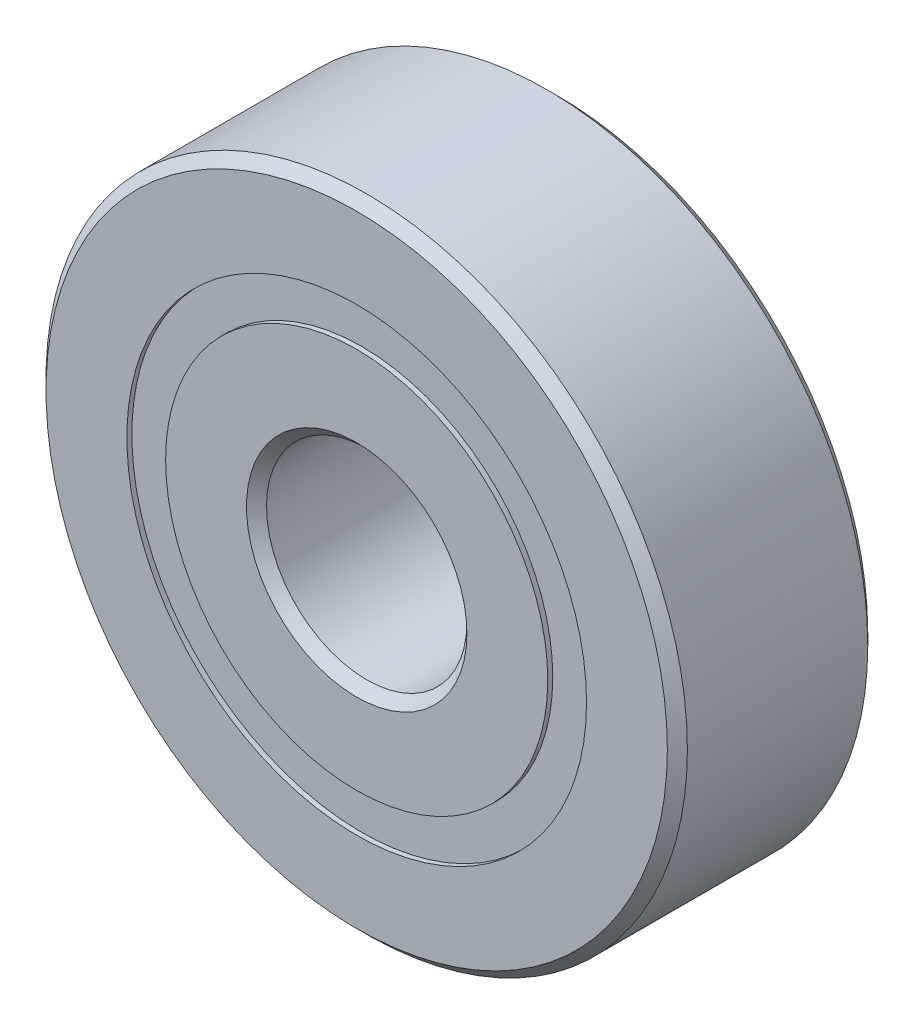
ISO-10303-21;
HEADER;
FILE_DESCRIPTION(('STEP AP214'),'2;1');
FILE_NAME('part.step','',(''),(''),'','','');
FILE_SCHEMA(('AUTOMOTIVE_DESIGN { 1 0 10303 214 1 1 1 1 }'));
ENDSEC;
DATA;
#1=APPLICATION_CONTEXT('core data for automotive mechanical design processes');
#2=APPLICATION_PROTOCOL_DEFINITION('international standard','automotive_design',2000,#1);
#3=PRODUCT_CONTEXT('',#1,'mechanical');
#4=PRODUCT('Part','Part','',(#3));
#5=PRODUCT_RELATED_PRODUCT_CATEGORY('part','',(#4));
#6=PRODUCT_DEFINITION_FORMATION('','',#4);
#7=PRODUCT_DEFINITION_CONTEXT('part definition',#1,'design');
#8=PRODUCT_DEFINITION('design','',#6,#7);
#9=PRODUCT_DEFINITION_SHAPE('','',#8);
#10=(LENGTH_UNIT() NAMED_UNIT(*) SI_UNIT(.MILLI.,.METRE.));
#11=(NAMED_UNIT(*) PLANE_ANGLE_UNIT() SI_UNIT($,.RADIAN.));
#12=(NAMED_UNIT(*) SI_UNIT($,.STERADIAN.) SOLID_ANGLE_UNIT());
#13=UNCERTAINTY_MEASURE_WITH_UNIT(LENGTH_MEASURE(1.E-05),#10,'distance_accuracy_value','');
#14=(GEOMETRIC_REPRESENTATION_CONTEXT(3) GLOBAL_UNCERTAINTY_ASSIGNED_CONTEXT((#13)) GLOBAL_UNIT_ASSIGNED_CONTEXT((#10,
#11,#12)) REPRESENTATION_CONTEXT('',''));
#15=CARTESIAN_POINT('',(0.,0.,0.));
#16=DIRECTION('',(0.,0.,1.));
#17=DIRECTION('',(1.,0.,0.));
#18=AXIS2_PLACEMENT_3D('',#15,#16,#17);
#19=CARTESIAN_POINT('',(0.,5.73351648351649,-2.375));
#20=DIRECTION('',(0.,0.,1.));
#21=DIRECTION('',(1.,0.,0.));
#22=AXIS2_PLACEMENT_3D('',#19,#20,#21);
#23=PLANE('',#22);
#24=CARTESIAN_POINT('',(0.,0.,-2.375));
#25=DIRECTION('',(0.,0.,1.));
#26=DIRECTION('',(1.,0.,0.));
#27=AXIS2_PLACEMENT_3D('',#24,#25,#26);
#28=CIRCLE('',#27,5.73351648351649);
#29=CARTESIAN_POINT('',(5.73351648351649,0.,-2.375));
#30=VERTEX_POINT('',#29);
#31=EDGE_CURVE('E55',#30,#30,#28,.T.);
#32=ORIENTED_EDGE('',*,*,#31,.F.);
#33=EDGE_LOOP('',(#32));
#34=FACE_BOUND('',#33,.T.);
#35=CARTESIAN_POINT('',(0.,0.,-2.375));
#36=DIRECTION('',(0.,0.,1.));
#37=DIRECTION('',(1.,0.,0.));
#38=AXIS2_PLACEMENT_3D('',#35,#36,#37);
#39=CIRCLE('',#38,4.76648351648352);
#40=CARTESIAN_POINT('',(4.76648351648352,0.,-2.375));
#41=VERTEX_POINT('',#40);
#42=EDGE_CURVE('E11',#41,#41,#39,.T.);
#43=ORIENTED_EDGE('',*,*,#42,.T.);
#44=EDGE_LOOP('',(#43));
#45=FACE_BOUND('',#44,.T.);
#46=ADVANCED_FACE('F41',(#34,#45),#23,.F.);
#47=CARTESIAN_POINT('',(0.,0.,2.5));
#48=DIRECTION('',(0.,0.,1.));
#49=DIRECTION('',(1.,0.,0.));
#50=AXIS2_PLACEMENT_3D('',#47,#48,#49);
#51=CYLINDRICAL_SURFACE('',#50,4.76648351648352);
#52=ORIENTED_EDGE('',*,*,#42,.F.);
#53=EDGE_LOOP('',(#52));
#54=FACE_BOUND('',#53,.T.);
#55=CARTESIAN_POINT('',(0.,0.,-1.21175743903915));
#56=DIRECTION('',(0.,0.,1.));
#57=DIRECTION('',(1.,0.,0.));
#58=AXIS2_PLACEMENT_3D('',#55,#56,#57);
#59=CIRCLE('',#58,4.76648351648352);
#60=CARTESIAN_POINT('',(4.76648351648352,0.,-1.21175743903915));
#61=VERTEX_POINT('',#60);
#62=EDGE_CURVE('E47',#61,#61,#59,.T.);
#63=ORIENTED_EDGE('',*,*,#62,.T.);
#64=EDGE_LOOP('',(#63));
#65=FACE_BOUND('',#64,.T.);
#66=ADVANCED_FACE('F64',(#54,#65),#51,.F.);
#67=CARTESIAN_POINT('',(0.,5.73351648351649,-1.21175743903915));
#68=DIRECTION('',(0.,0.,-1.));
#69=DIRECTION('',(-1.,0.,0.));
#70=AXIS2_PLACEMENT_3D('',#67,#68,#69);
#71=PLANE('',#70);
#72=ORIENTED_EDGE('',*,*,#62,.F.);
#73=EDGE_LOOP('',(#72));
#74=FACE_BOUND('',#73,.T.);
#75=CARTESIAN_POINT('',(0.,0.,-1.21175743903915));
#76=DIRECTION('',(0.,0.,1.));
#77=DIRECTION('',(1.,0.,0.));
#78=AXIS2_PLACEMENT_3D('',#75,#76,#77);
#79=CIRCLE('',#78,5.73351648351649);
#80=CARTESIAN_POINT('',(5.73351648351649,0.,-1.21175743903915));
#81=VERTEX_POINT('',#80);
#82=EDGE_CURVE('E51',#81,#81,#79,.T.);
#83=ORIENTED_EDGE('',*,*,#82,.T.);
#84=EDGE_LOOP('',(#83));
#85=FACE_BOUND('',#84,.T.);
#86=ADVANCED_FACE('F68',(#74,#85),#71,.F.);
#87=CARTESIAN_POINT('',(0.,0.,2.5));
#88=DIRECTION('',(0.,0.,1.));
#89=DIRECTION('',(1.,0.,0.));
#90=AXIS2_PLACEMENT_3D('',#87,#88,#89);
#91=CYLINDRICAL_SURFACE('',#90,5.73351648351649);
#92=ORIENTED_EDGE('',*,*,#82,.F.);
#93=EDGE_LOOP('',(#92));
#94=FACE_BOUND('',#93,.T.);
#95=ORIENTED_EDGE('',*,*,#31,.T.);
#96=EDGE_LOOP('',(#95));
#97=FACE_BOUND('',#96,.T.);
#98=ADVANCED_FACE('F61',(#94,#97),#91,.T.);
#99=CLOSED_SHELL('',(#46,#66,#86,#98));
#100=MANIFOLD_SOLID_BREP('B2',#99);
#101=CARTESIAN_POINT('',(0.,5.73351648351648,2.375));
#102=DIRECTION('',(0.,0.,-1.));
#103=DIRECTION('',(-1.,0.,0.));
#104=AXIS2_PLACEMENT_3D('',#101,#102,#103);
#105=PLANE('',#104);
#106=CARTESIAN_POINT('',(0.,0.,2.375));
#107=DIRECTION('',(0.,0.,1.));
#108=DIRECTION('',(1.,0.,0.));
#109=AXIS2_PLACEMENT_3D('',#106,#107,#108);
#110=CIRCLE('',#109,4.76648351648352);
#111=CARTESIAN_POINT('',(4.76648351648352,0.,2.375));
#112=VERTEX_POINT('',#111);
#113=EDGE_CURVE('E40',#112,#112,#110,.T.);
#114=ORIENTED_EDGE('',*,*,#113,.F.);
#115=EDGE_LOOP('',(#114));
#116=FACE_BOUND('',#115,.T.);
#117=CARTESIAN_POINT('',(0.,0.,2.375));
#118=DIRECTION('',(0.,0.,1.));
#119=DIRECTION('',(1.,0.,0.));
#120=AXIS2_PLACEMENT_3D('',#117,#118,#119);
#121=CIRCLE('',#120,5.73351648351648);
#122=CARTESIAN_POINT('',(5.73351648351648,0.,2.375));
#123=VERTEX_POINT('',#122);
#124=EDGE_CURVE('E122',#123,#123,#121,.T.);
#125=ORIENTED_EDGE('',*,*,#124,.T.);
#126=EDGE_LOOP('',(#125));
#127=FACE_BOUND('',#126,.T.);
#128=ADVANCED_FACE('F108',(#116,#127),#105,.F.);
#129=CARTESIAN_POINT('',(0.,0.,2.5));
#130=DIRECTION('',(0.,0.,1.));
#131=DIRECTION('',(1.,0.,0.));
#132=AXIS2_PLACEMENT_3D('',#129,#130,#131);
#133=CYLINDRICAL_SURFACE('',#132,4.76648351648352);
#134=CARTESIAN_POINT('',(0.,0.,1.21175743903915));
#135=DIRECTION('',(0.,0.,1.));
#136=DIRECTION('',(1.,0.,0.));
#137=AXIS2_PLACEMENT_3D('',#134,#135,#136);
#138=CIRCLE('',#137,4.76648351648352);
#139=CARTESIAN_POINT('',(4.76648351648352,0.,1.21175743903915));
#140=VERTEX_POINT('',#139);
#141=EDGE_CURVE('E114',#140,#140,#138,.T.);
#142=ORIENTED_EDGE('',*,*,#141,.F.);
#143=EDGE_LOOP('',(#142));
#144=FACE_BOUND('',#143,.T.);
#145=ORIENTED_EDGE('',*,*,#113,.T.);
#146=EDGE_LOOP('',(#145));
#147=FACE_BOUND('',#146,.T.);
#148=ADVANCED_FACE('F137',(#144,#147),#133,.F.);
#149=CARTESIAN_POINT('',(0.,5.73351648351648,1.21175743903915));
#150=DIRECTION('',(0.,0.,1.));
#151=DIRECTION('',(1.,0.,0.));
#152=AXIS2_PLACEMENT_3D('',#149,#150,#151);
#153=PLANE('',#152);
#154=CARTESIAN_POINT('',(0.,0.,1.21175743903915));
#155=DIRECTION('',(0.,0.,1.));
#156=DIRECTION('',(1.,0.,0.));
#157=AXIS2_PLACEMENT_3D('',#154,#155,#156);
#158=CIRCLE('',#157,5.73351648351648);
#159=CARTESIAN_POINT('',(5.73351648351648,0.,1.21175743903915));
#160=VERTEX_POINT('',#159);
#161=EDGE_CURVE('E118',#160,#160,#158,.T.);
#162=ORIENTED_EDGE('',*,*,#161,.F.);
#163=EDGE_LOOP('',(#162));
#164=FACE_BOUND('',#163,.T.);
#165=ORIENTED_EDGE('',*,*,#141,.T.);
#166=EDGE_LOOP('',(#165));
#167=FACE_BOUND('',#166,.T.);
#168=ADVANCED_FACE('F132',(#164,#167),#153,.F.);
#169=CARTESIAN_POINT('',(0.,0.,2.5));
#170=DIRECTION('',(0.,0.,1.));
#171=DIRECTION('',(1.,0.,0.));
#172=AXIS2_PLACEMENT_3D('',#169,#170,#171);
#173=CYLINDRICAL_SURFACE('',#172,5.73351648351648);
#174=ORIENTED_EDGE('',*,*,#124,.F.);
#175=EDGE_LOOP('',(#174));
#176=FACE_BOUND('',#175,.T.);
#177=ORIENTED_EDGE('',*,*,#161,.T.);
#178=EDGE_LOOP('',(#177));
#179=FACE_BOUND('',#178,.T.);
#180=ADVANCED_FACE('F129',(#176,#179),#173,.T.);
#181=CLOSED_SHELL('',(#128,#148,#168,#180));
#182=MANIFOLD_SOLID_BREP('B6',#181);
#183=CARTESIAN_POINT('',(-2.62499999999994,4.54663336986834,0.));
#184=DIRECTION('',(0.,0.,1.));
#185=DIRECTION('',(-0.499999999999989,0.866025403784445,0.));
#186=AXIS2_PLACEMENT_3D('',#183,#184,#185);
#187=SPHERICAL_SURFACE('',#186,1.21175743903915);
#188=CARTESIAN_POINT('',(-2.62499999999994,4.54663336986834,1.21175743903915));
#189=VERTEX_POINT('',#188);
#190=VERTEX_LOOP('',#189);
#191=FACE_BOUND('',#190,.T.);
#192=ADVANCED_FACE('F175',(#191),#187,.T.);
#193=CLOSED_SHELL('',(#192));
#194=MANIFOLD_SOLID_BREP('B35',#193);
#195=CARTESIAN_POINT('',(-4.54663336986827,2.62500000000005,0.));
#196=DIRECTION('',(0.,0.,1.));
#197=DIRECTION('',(-0.866025403784433,0.50000000000001,0.));
#198=AXIS2_PLACEMENT_3D('',#195,#196,#197);
#199=SPHERICAL_SURFACE('',#198,1.21175743903915);
#200=CARTESIAN_POINT('',(-4.54663336986827,2.62500000000005,1.21175743903915));
#201=VERTEX_POINT('',#200);
#202=VERTEX_LOOP('',#201);
#203=FACE_BOUND('',#202,.T.);
#204=ADVANCED_FACE('F195',(#203),#199,.T.);
#205=CLOSED_SHELL('',(#204));
#206=MANIFOLD_SOLID_BREP('B104',#205);
#207=CARTESIAN_POINT('',(-5.25,0.,0.));
#208=DIRECTION('',(0.,0.,1.));
#209=DIRECTION('',(-1.,0.,0.));
#210=AXIS2_PLACEMENT_3D('',#207,#208,#209);
#211=SPHERICAL_SURFACE('',#210,1.21175743903915);
#212=CARTESIAN_POINT('',(-5.25,0.,1.21175743903915));
#213=VERTEX_POINT('',#212);
#214=VERTEX_LOOP('',#213);
#215=FACE_BOUND('',#214,.T.);
#216=ADVANCED_FACE('F215',(#215),#211,.T.);
#217=CLOSED_SHELL('',(#216));
#218=MANIFOLD_SOLID_BREP('B171',#217);
#219=CARTESIAN_POINT('',(-4.54663336986833,-2.62499999999996,0.));
#220=DIRECTION('',(0.,0.,1.));
#221=DIRECTION('',(-0.866025403784443,-0.499999999999992,0.));
#222=AXIS2_PLACEMENT_3D('',#219,#220,#221);
#223=SPHERICAL_SURFACE('',#222,1.21175743903915);
#224=CARTESIAN_POINT('',(-4.54663336986833,-2.62499999999996,1.21175743903915));
#225=VERTEX_POINT('',#224);
#226=VERTEX_LOOP('',#225);
#227=FACE_BOUND('',#226,.T.);
#228=ADVANCED_FACE('F235',(#227),#223,.T.);
#229=CLOSED_SHELL('',(#228));
#230=MANIFOLD_SOLID_BREP('B191',#229);
#231=CARTESIAN_POINT('',(-2.62500000000004,-4.54663336986828,0.));
#232=DIRECTION('',(0.,0.,1.));
#233=DIRECTION('',(-0.500000000000007,-0.866025403784435,0.));
#234=AXIS2_PLACEMENT_3D('',#231,#232,#233);
#235=SPHERICAL_SURFACE('',#234,1.21175743903915);
#236=CARTESIAN_POINT('',(-2.62500000000004,-4.54663336986828,1.21175743903915));
#237=VERTEX_POINT('',#236);
#238=VERTEX_LOOP('',#237);
#239=FACE_BOUND('',#238,.T.);
#240=ADVANCED_FACE('F255',(#239),#235,.T.);
#241=CLOSED_SHELL('',(#240));
#242=MANIFOLD_SOLID_BREP('B211',#241);
#243=CARTESIAN_POINT('',(0.,-5.25,0.));
#244=DIRECTION('',(0.,0.,1.));
#245=DIRECTION('',(0.,-1.,0.));
#246=AXIS2_PLACEMENT_3D('',#243,#244,#245);
#247=SPHERICAL_SURFACE('',#246,1.21175743903915);
#248=CARTESIAN_POINT('',(0.,-5.25,1.21175743903915));
#249=VERTEX_POINT('',#248);
#250=VERTEX_LOOP('',#249);
#251=FACE_BOUND('',#250,.T.);
#252=ADVANCED_FACE('F275',(#251),#247,.T.);
#253=CLOSED_SHELL('',(#252));
#254=MANIFOLD_SOLID_BREP('B231',#253);
#255=CARTESIAN_POINT('',(2.62499999999997,-4.54663336986832,0.));
#256=DIRECTION('',(0.,0.,1.));
#257=DIRECTION('',(0.499999999999995,-0.866025403784442,0.));
#258=AXIS2_PLACEMENT_3D('',#255,#256,#257);
#259=SPHERICAL_SURFACE('',#258,1.21175743903915);
#260=CARTESIAN_POINT('',(2.62499999999997,-4.54663336986832,1.21175743903915));
#261=VERTEX_POINT('',#260);
#262=VERTEX_LOOP('',#261);
#263=FACE_BOUND('',#262,.T.);
#264=ADVANCED_FACE('F295',(#263),#259,.T.);
#265=CLOSED_SHELL('',(#264));
#266=MANIFOLD_SOLID_BREP('B251',#265);
#267=CARTESIAN_POINT('',(4.54663336986829,-2.62500000000002,0.));
#268=DIRECTION('',(0.,0.,1.));
#269=DIRECTION('',(0.866025403784436,-0.500000000000004,0.));
#270=AXIS2_PLACEMENT_3D('',#267,#268,#269);
#271=SPHERICAL_SURFACE('',#270,1.21175743903915);
#272=CARTESIAN_POINT('',(4.54663336986829,-2.62500000000002,1.21175743903915));
#273=VERTEX_POINT('',#272);
#274=VERTEX_LOOP('',#273);
#275=FACE_BOUND('',#274,.T.);
#276=ADVANCED_FACE('F315',(#275),#271,.T.);
#277=CLOSED_SHELL('',(#276));
#278=MANIFOLD_SOLID_BREP('B271',#277);
#279=CARTESIAN_POINT('',(5.25,0.,0.));
#280=DIRECTION('',(0.,0.,1.));
#281=DIRECTION('',(1.,0.,0.));
#282=AXIS2_PLACEMENT_3D('',#279,#280,#281);
#283=SPHERICAL_SURFACE('',#282,1.21175743903915);
#284=CARTESIAN_POINT('',(5.25,0.,1.21175743903915));
#285=VERTEX_POINT('',#284);
#286=VERTEX_LOOP('',#285);
#287=FACE_BOUND('',#286,.T.);
#288=ADVANCED_FACE('F335',(#287),#283,.T.);
#289=CLOSED_SHELL('',(#288));
#290=MANIFOLD_SOLID_BREP('B291',#289);
#291=CARTESIAN_POINT('',(4.54663336986831,2.62499999999999,0.));
#292=DIRECTION('',(0.,0.,1.));
#293=DIRECTION('',(0.86602540378444,0.499999999999998,0.));
#294=AXIS2_PLACEMENT_3D('',#291,#292,#293);
#295=SPHERICAL_SURFACE('',#294,1.21175743903915);
#296=CARTESIAN_POINT('',(4.54663336986831,2.62499999999999,1.21175743903915));
#297=VERTEX_POINT('',#296);
#298=VERTEX_LOOP('',#297);
#299=FACE_BOUND('',#298,.T.);
#300=ADVANCED_FACE('F355',(#299),#295,.T.);
#301=CLOSED_SHELL('',(#300));
#302=MANIFOLD_SOLID_BREP('B311',#301);
#303=CARTESIAN_POINT('',(2.62500000000001,4.5466333698683,0.));
#304=DIRECTION('',(0.,0.,1.));
#305=DIRECTION('',(0.500000000000001,0.866025403784438,0.));
#306=AXIS2_PLACEMENT_3D('',#303,#304,#305);
#307=SPHERICAL_SURFACE('',#306,1.21175743903915);
#308=CARTESIAN_POINT('',(2.62500000000001,4.5466333698683,1.21175743903915));
#309=VERTEX_POINT('',#308);
#310=VERTEX_LOOP('',#309);
#311=FACE_BOUND('',#310,.T.);
#312=ADVANCED_FACE('F375',(#311),#307,.T.);
#313=CLOSED_SHELL('',(#312));
#314=MANIFOLD_SOLID_BREP('B331',#313);
#315=CARTESIAN_POINT('',(0.,5.25,0.));
#316=DIRECTION('',(0.,0.,1.));
#317=DIRECTION('',(0.,1.,0.));
#318=AXIS2_PLACEMENT_3D('',#315,#316,#317);
#319=SPHERICAL_SURFACE('',#318,1.21175743903915);
#320=CARTESIAN_POINT('',(0.,5.25,1.21175743903915));
#321=VERTEX_POINT('',#320);
#322=VERTEX_LOOP('',#321);
#323=FACE_BOUND('',#322,.T.);
#324=ADVANCED_FACE('F397',(#323),#319,.T.);
#325=CLOSED_SHELL('',(#324));
#326=MANIFOLD_SOLID_BREP('B351',#325);
#327=CARTESIAN_POINT('',(0.,4.76648351648352,2.5));
#328=DIRECTION('',(0.,0.,-1.));
#329=DIRECTION('',(-1.,0.,0.));
#330=AXIS2_PLACEMENT_3D('',#327,#328,#329);
#331=PLANE('',#330);
#332=CARTESIAN_POINT('',(0.,0.,2.5));
#333=DIRECTION('',(0.,0.,1.));
#334=DIRECTION('',(1.,0.,0.));
#335=AXIS2_PLACEMENT_3D('',#332,#333,#334);
#336=CIRCLE('',#335,2.75);
#337=CARTESIAN_POINT('',(2.75,0.,2.5));
#338=VERTEX_POINT('',#337);
#339=EDGE_CURVE('E444',#338,#338,#336,.T.);
#340=ORIENTED_EDGE('',*,*,#339,.F.);
#341=EDGE_LOOP('',(#340));
#342=FACE_BOUND('',#341,.T.);
#343=CARTESIAN_POINT('',(0.,0.,2.5));
#344=DIRECTION('',(0.,0.,1.));
#345=DIRECTION('',(1.,0.,0.));
#346=AXIS2_PLACEMENT_3D('',#343,#344,#345);
#347=CIRCLE('',#346,4.76648351648352);
#348=CARTESIAN_POINT('',(4.76648351648352,0.,2.5));
#349=VERTEX_POINT('',#348);
#350=EDGE_CURVE('E396',#349,#349,#347,.T.);
#351=ORIENTED_EDGE('',*,*,#350,.T.);
#352=EDGE_LOOP('',(#351));
#353=FACE_BOUND('',#352,.T.);
#354=ADVANCED_FACE('F416',(#342,#353),#331,.F.);
#355=CARTESIAN_POINT('',(0.,0.,2.5));
#356=DIRECTION('',(0.,0.,1.));
#357=DIRECTION('',(1.,0.,0.));
#358=AXIS2_PLACEMENT_3D('',#355,#356,#357);
#359=CYLINDRICAL_SURFACE('',#358,4.76648351648352);
#360=ORIENTED_EDGE('',*,*,#350,.F.);
#361=EDGE_LOOP('',(#360));
#362=FACE_BOUND('',#361,.T.);
#363=CARTESIAN_POINT('',(0.,0.,1.11111111111111));
#364=DIRECTION('',(0.,0.,1.));
#365=DIRECTION('',(1.,0.,0.));
#366=AXIS2_PLACEMENT_3D('',#363,#364,#365);
#367=CIRCLE('',#366,4.76648351648352);
#368=CARTESIAN_POINT('',(4.76648351648352,0.,1.11111111111111));
#369=VERTEX_POINT('',#368);
#370=EDGE_CURVE('E422',#369,#369,#367,.T.);
#371=ORIENTED_EDGE('',*,*,#370,.T.);
#372=EDGE_LOOP('',(#371));
#373=FACE_BOUND('',#372,.T.);
#374=ADVANCED_FACE('F451',(#362,#373),#359,.T.);
#375=CARTESIAN_POINT('',(0.,0.,0.));
#376=DIRECTION('',(0.,0.,1.));
#377=DIRECTION('',(1.,0.,0.));
#378=AXIS2_PLACEMENT_3D('',#375,#376,#377);
#379=TOROIDAL_SURFACE('',#378,5.25,1.21175743903915);
#380=ORIENTED_EDGE('',*,*,#370,.F.);
#381=EDGE_LOOP('',(#380));
#382=FACE_BOUND('',#381,.T.);
#383=CARTESIAN_POINT('',(0.,0.,-1.11111111111111));
#384=DIRECTION('',(0.,0.,1.));
#385=DIRECTION('',(1.,0.,0.));
#386=AXIS2_PLACEMENT_3D('',#383,#384,#385);
#387=CIRCLE('',#386,4.76648351648352);
#388=CARTESIAN_POINT('',(4.76648351648352,0.,-1.11111111111111));
#389=VERTEX_POINT('',#388);
#390=EDGE_CURVE('E426',#389,#389,#387,.T.);
#391=ORIENTED_EDGE('',*,*,#390,.T.);
#392=EDGE_LOOP('',(#391));
#393=FACE_BOUND('',#392,.T.);
#394=ADVANCED_FACE('F455',(#382,#393),#379,.F.);
#395=CARTESIAN_POINT('',(0.,0.,2.5));
#396=DIRECTION('',(0.,0.,1.));
#397=DIRECTION('',(1.,0.,0.));
#398=AXIS2_PLACEMENT_3D('',#395,#396,#397);
#399=CYLINDRICAL_SURFACE('',#398,4.76648351648352);
#400=ORIENTED_EDGE('',*,*,#390,.F.);
#401=EDGE_LOOP('',(#400));
#402=FACE_BOUND('',#401,.T.);
#403=CARTESIAN_POINT('',(0.,0.,-2.5));
#404=DIRECTION('',(0.,0.,1.));
#405=DIRECTION('',(1.,0.,0.));
#406=AXIS2_PLACEMENT_3D('',#403,#404,#405);
#407=CIRCLE('',#406,4.76648351648352);
#408=CARTESIAN_POINT('',(4.76648351648352,0.,-2.5));
#409=VERTEX_POINT('',#408);
#410=EDGE_CURVE('E430',#409,#409,#407,.T.);
#411=ORIENTED_EDGE('',*,*,#410,.T.);
#412=EDGE_LOOP('',(#411));
#413=FACE_BOUND('',#412,.T.);
#414=ADVANCED_FACE('F460',(#402,#413),#399,.T.);
#415=CARTESIAN_POINT('',(0.,2.75,-2.5));
#416=DIRECTION('',(0.,0.,1.));
#417=DIRECTION('',(1.,0.,0.));
#418=AXIS2_PLACEMENT_3D('',#415,#416,#417);
#419=PLANE('',#418);
#420=ORIENTED_EDGE('',*,*,#410,.F.);
#421=EDGE_LOOP('',(#420));
#422=FACE_BOUND('',#421,.T.);
#423=CARTESIAN_POINT('',(0.,0.,-2.5));
#424=DIRECTION('',(0.,0.,1.));
#425=DIRECTION('',(1.,0.,0.));
#426=AXIS2_PLACEMENT_3D('',#423,#424,#425);
#427=CIRCLE('',#426,2.75);
#428=CARTESIAN_POINT('',(2.75,0.,-2.5));
#429=VERTEX_POINT('',#428);
#430=EDGE_CURVE('E435',#429,#429,#427,.T.);
#431=ORIENTED_EDGE('',*,*,#430,.T.);
#432=EDGE_LOOP('',(#431));
#433=FACE_BOUND('',#432,.T.);
#434=ADVANCED_FACE('F466',(#422,#433),#419,.F.);
#435=CARTESIAN_POINT('',(0.,0.,-2.25));
#436=DIRECTION('',(0.,0.,-1.));
#437=DIRECTION('',(-1.,0.,0.));
#438=AXIS2_PLACEMENT_3D('',#435,#436,#437);
#439=CONICAL_SURFACE('',#438,2.5,0.785398163397447);
#440=ORIENTED_EDGE('',*,*,#430,.F.);
#441=EDGE_LOOP('',(#440));
#442=FACE_BOUND('',#441,.T.);
#443=CARTESIAN_POINT('',(0.,0.,-2.25));
#444=DIRECTION('',(0.,0.,1.));
#445=DIRECTION('',(1.,0.,0.));
#446=AXIS2_PLACEMENT_3D('',#443,#444,#445);
#447=CIRCLE('',#446,2.5);
#448=CARTESIAN_POINT('',(2.5,0.,-2.25));
#449=VERTEX_POINT('',#448);
#450=EDGE_CURVE('E438',#449,#449,#447,.T.);
#451=ORIENTED_EDGE('',*,*,#450,.T.);
#452=EDGE_LOOP('',(#451));
#453=FACE_BOUND('',#452,.T.);
#454=ADVANCED_FACE('F470',(#442,#453),#439,.F.);
#455=CARTESIAN_POINT('',(0.,0.,2.5));
#456=DIRECTION('',(0.,0.,1.));
#457=DIRECTION('',(1.,0.,0.));
#458=AXIS2_PLACEMENT_3D('',#455,#456,#457);
#459=CYLINDRICAL_SURFACE('',#458,2.5);
#460=ORIENTED_EDGE('',*,*,#450,.F.);
#461=EDGE_LOOP('',(#460));
#462=FACE_BOUND('',#461,.T.);
#463=CARTESIAN_POINT('',(0.,0.,2.25));
#464=DIRECTION('',(0.,0.,1.));
#465=DIRECTION('',(1.,0.,0.));
#466=AXIS2_PLACEMENT_3D('',#463,#464,#465);
#467=CIRCLE('',#466,2.5);
#468=CARTESIAN_POINT('',(2.5,0.,2.25));
#469=VERTEX_POINT('',#468);
#470=EDGE_CURVE('E441',#469,#469,#467,.T.);
#471=ORIENTED_EDGE('',*,*,#470,.T.);
#472=EDGE_LOOP('',(#471));
#473=FACE_BOUND('',#472,.T.);
#474=ADVANCED_FACE('F474',(#462,#473),#459,.F.);
#475=CARTESIAN_POINT('',(0.,0.,2.5));
#476=DIRECTION('',(0.,0.,1.));
#477=DIRECTION('',(1.,0.,0.));
#478=AXIS2_PLACEMENT_3D('',#475,#476,#477);
#479=CONICAL_SURFACE('',#478,2.75,0.785398163397452);
#480=ORIENTED_EDGE('',*,*,#470,.F.);
#481=EDGE_LOOP('',(#480));
#482=FACE_BOUND('',#481,.T.);
#483=ORIENTED_EDGE('',*,*,#339,.T.);
#484=EDGE_LOOP('',(#483));
#485=FACE_BOUND('',#484,.T.);
#486=ADVANCED_FACE('F448',(#482,#485),#479,.F.);
#487=CLOSED_SHELL('',(#354,#374,#394,#414,#434,#454,#474,#486));
#488=MANIFOLD_SOLID_BREP('B371',#487);
#489=CARTESIAN_POINT('',(0.,0.,2.25));
#490=DIRECTION('',(0.,0.,-1.));
#491=DIRECTION('',(-1.,0.,0.));
#492=AXIS2_PLACEMENT_3D('',#489,#490,#491);
#493=CONICAL_SURFACE('',#492,8.,0.785398163397448);
#494=CARTESIAN_POINT('',(0.,0.,2.5));
#495=DIRECTION('',(0.,0.,1.));
#496=DIRECTION('',(1.,0.,0.));
#497=AXIS2_PLACEMENT_3D('',#494,#495,#496);
#498=CIRCLE('',#497,7.75);
#499=CARTESIAN_POINT('',(7.75,0.,2.5));
#500=VERTEX_POINT('',#499);
#501=EDGE_CURVE('E565',#500,#500,#498,.T.);
#502=ORIENTED_EDGE('',*,*,#501,.F.);
#503=EDGE_LOOP('',(#502));
#504=FACE_BOUND('',#503,.T.);
#505=CARTESIAN_POINT('',(0.,0.,2.25));
#506=DIRECTION('',(0.,0.,1.));
#507=DIRECTION('',(1.,0.,0.));
#508=AXIS2_PLACEMENT_3D('',#505,#506,#507);
#509=CIRCLE('',#508,8.);
#510=CARTESIAN_POINT('',(8.,0.,2.25));
#511=VERTEX_POINT('',#510);
#512=EDGE_CURVE('E415',#511,#511,#509,.T.);
#513=ORIENTED_EDGE('',*,*,#512,.T.);
#514=EDGE_LOOP('',(#513));
#515=FACE_BOUND('',#514,.T.);
#516=ADVANCED_FACE('F537',(#504,#515),#493,.T.);
#517=CARTESIAN_POINT('',(0.,0.,2.5));
#518=DIRECTION('',(0.,0.,1.));
#519=DIRECTION('',(1.,0.,0.));
#520=AXIS2_PLACEMENT_3D('',#517,#518,#519);
#521=CYLINDRICAL_SURFACE('',#520,8.);
#522=ORIENTED_EDGE('',*,*,#512,.F.);
#523=EDGE_LOOP('',(#522));
#524=FACE_BOUND('',#523,.T.);
#525=CARTESIAN_POINT('',(0.,0.,-2.25));
#526=DIRECTION('',(0.,0.,1.));
#527=DIRECTION('',(1.,0.,0.));
#528=AXIS2_PLACEMENT_3D('',#525,#526,#527);
#529=CIRCLE('',#528,8.);
#530=CARTESIAN_POINT('',(8.,0.,-2.25));
#531=VERTEX_POINT('',#530);
#532=EDGE_CURVE('E543',#531,#531,#529,.T.);
#533=ORIENTED_EDGE('',*,*,#532,.T.);
#534=EDGE_LOOP('',(#533));
#535=FACE_BOUND('',#534,.T.);
#536=ADVANCED_FACE('F572',(#524,#535),#521,.T.);
#537=CARTESIAN_POINT('',(0.,0.,-2.5));
#538=DIRECTION('',(0.,0.,1.));
#539=DIRECTION('',(1.,0.,0.));
#540=AXIS2_PLACEMENT_3D('',#537,#538,#539);
#541=CONICAL_SURFACE('',#540,7.75,0.785398163397447);
#542=ORIENTED_EDGE('',*,*,#532,.F.);
#543=EDGE_LOOP('',(#542));
#544=FACE_BOUND('',#543,.T.);
#545=CARTESIAN_POINT('',(0.,0.,-2.5));
#546=DIRECTION('',(0.,0.,1.));
#547=DIRECTION('',(1.,0.,0.));
#548=AXIS2_PLACEMENT_3D('',#545,#546,#547);
#549=CIRCLE('',#548,7.75);
#550=CARTESIAN_POINT('',(7.75,0.,-2.5));
#551=VERTEX_POINT('',#550);
#552=EDGE_CURVE('E547',#551,#551,#549,.T.);
#553=ORIENTED_EDGE('',*,*,#552,.T.);
#554=EDGE_LOOP('',(#553));
#555=FACE_BOUND('',#554,.T.);
#556=ADVANCED_FACE('F576',(#544,#555),#541,.T.);
#557=CARTESIAN_POINT('',(0.,7.75,-2.5));
#558=DIRECTION('',(0.,0.,1.));
#559=DIRECTION('',(1.,0.,0.));
#560=AXIS2_PLACEMENT_3D('',#557,#558,#559);
#561=PLANE('',#560);
#562=ORIENTED_EDGE('',*,*,#552,.F.);
#563=EDGE_LOOP('',(#562));
#564=FACE_BOUND('',#563,.T.);
#565=CARTESIAN_POINT('',(0.,0.,-2.5));
#566=DIRECTION('',(0.,0.,1.));
#567=DIRECTION('',(1.,0.,0.));
#568=AXIS2_PLACEMENT_3D('',#565,#566,#567);
#569=CIRCLE('',#568,5.73351648351649);
#570=CARTESIAN_POINT('',(5.73351648351649,0.,-2.5));
#571=VERTEX_POINT('',#570);
#572=EDGE_CURVE('E551',#571,#571,#569,.T.);
#573=ORIENTED_EDGE('',*,*,#572,.T.);
#574=EDGE_LOOP('',(#573));
#575=FACE_BOUND('',#574,.T.);
#576=ADVANCED_FACE('F581',(#564,#575),#561,.F.);
#577=CARTESIAN_POINT('',(0.,0.,2.5));
#578=DIRECTION('',(0.,0.,1.));
#579=DIRECTION('',(1.,0.,0.));
#580=AXIS2_PLACEMENT_3D('',#577,#578,#579);
#581=CYLINDRICAL_SURFACE('',#580,5.73351648351648);
#582=ORIENTED_EDGE('',*,*,#572,.F.);
#583=EDGE_LOOP('',(#582));
#584=FACE_BOUND('',#583,.T.);
#585=CARTESIAN_POINT('',(0.,0.,-1.11111111111111));
#586=DIRECTION('',(0.,0.,1.));
#587=DIRECTION('',(1.,0.,0.));
#588=AXIS2_PLACEMENT_3D('',#585,#586,#587);
#589=CIRCLE('',#588,5.73351648351648);
#590=CARTESIAN_POINT('',(5.73351648351648,0.,-1.11111111111111));
#591=VERTEX_POINT('',#590);
#592=EDGE_CURVE('E556',#591,#591,#589,.T.);
#593=ORIENTED_EDGE('',*,*,#592,.T.);
#594=EDGE_LOOP('',(#593));
#595=FACE_BOUND('',#594,.T.);
#596=ADVANCED_FACE('F587',(#584,#595),#581,.F.);
#597=CARTESIAN_POINT('',(0.,0.,0.));
#598=DIRECTION('',(0.,0.,1.));
#599=DIRECTION('',(1.,0.,0.));
#600=AXIS2_PLACEMENT_3D('',#597,#598,#599);
#601=TOROIDAL_SURFACE('',#600,5.25,1.21175743903915);
#602=ORIENTED_EDGE('',*,*,#592,.F.);
#603=EDGE_LOOP('',(#602));
#604=FACE_BOUND('',#603,.T.);
#605=CARTESIAN_POINT('',(0.,0.,1.11111111111111));
#606=DIRECTION('',(0.,0.,1.));
#607=DIRECTION('',(1.,0.,0.));
#608=AXIS2_PLACEMENT_3D('',#605,#606,#607);
#609=CIRCLE('',#608,5.73351648351648);
#610=CARTESIAN_POINT('',(5.73351648351648,0.,1.11111111111111));
#611=VERTEX_POINT('',#610);
#612=EDGE_CURVE('E559',#611,#611,#609,.T.);
#613=ORIENTED_EDGE('',*,*,#612,.T.);
#614=EDGE_LOOP('',(#613));
#615=FACE_BOUND('',#614,.T.);
#616=ADVANCED_FACE('F591',(#604,#615),#601,.F.);
#617=CARTESIAN_POINT('',(0.,0.,2.5));
#618=DIRECTION('',(0.,0.,1.));
#619=DIRECTION('',(1.,0.,0.));
#620=AXIS2_PLACEMENT_3D('',#617,#618,#619);
#621=CYLINDRICAL_SURFACE('',#620,5.73351648351648);
#622=ORIENTED_EDGE('',*,*,#612,.F.);
#623=EDGE_LOOP('',(#622));
#624=FACE_BOUND('',#623,.T.);
#625=CARTESIAN_POINT('',(0.,0.,2.5));
#626=DIRECTION('',(0.,0.,1.));
#627=DIRECTION('',(1.,0.,0.));
#628=AXIS2_PLACEMENT_3D('',#625,#626,#627);
#629=CIRCLE('',#628,5.73351648351648);
#630=CARTESIAN_POINT('',(5.73351648351648,0.,2.5));
#631=VERTEX_POINT('',#630);
#632=EDGE_CURVE('E562',#631,#631,#629,.T.);
#633=ORIENTED_EDGE('',*,*,#632,.T.);
#634=EDGE_LOOP('',(#633));
#635=FACE_BOUND('',#634,.T.);
#636=ADVANCED_FACE('F595',(#624,#635),#621,.F.);
#637=CARTESIAN_POINT('',(0.,7.75,2.5));
#638=DIRECTION('',(0.,0.,-1.));
#639=DIRECTION('',(-1.,0.,0.));
#640=AXIS2_PLACEMENT_3D('',#637,#638,#639);
#641=PLANE('',#640);
#642=ORIENTED_EDGE('',*,*,#632,.F.);
#643=EDGE_LOOP('',(#642));
#644=FACE_BOUND('',#643,.T.);
#645=ORIENTED_EDGE('',*,*,#501,.T.);
#646=EDGE_LOOP('',(#645));
#647=FACE_BOUND('',#646,.T.);
#648=ADVANCED_FACE('F569',(#644,#647),#641,.F.);
#649=CLOSED_SHELL('',(#516,#536,#556,#576,#596,#616,#636,#648));
#650=MANIFOLD_SOLID_BREP('B391',#649);
#651=ADVANCED_BREP_SHAPE_REPRESENTATION('',(#18,#100,#182,#194,#206,#218,#230,#242,#254,#266,
#278,#290,#302,#314,#326,#488,#650),#14);
#652=SHAPE_DEFINITION_REPRESENTATION(#9,#651);
ENDSEC;
END-ISO-10303-21;
